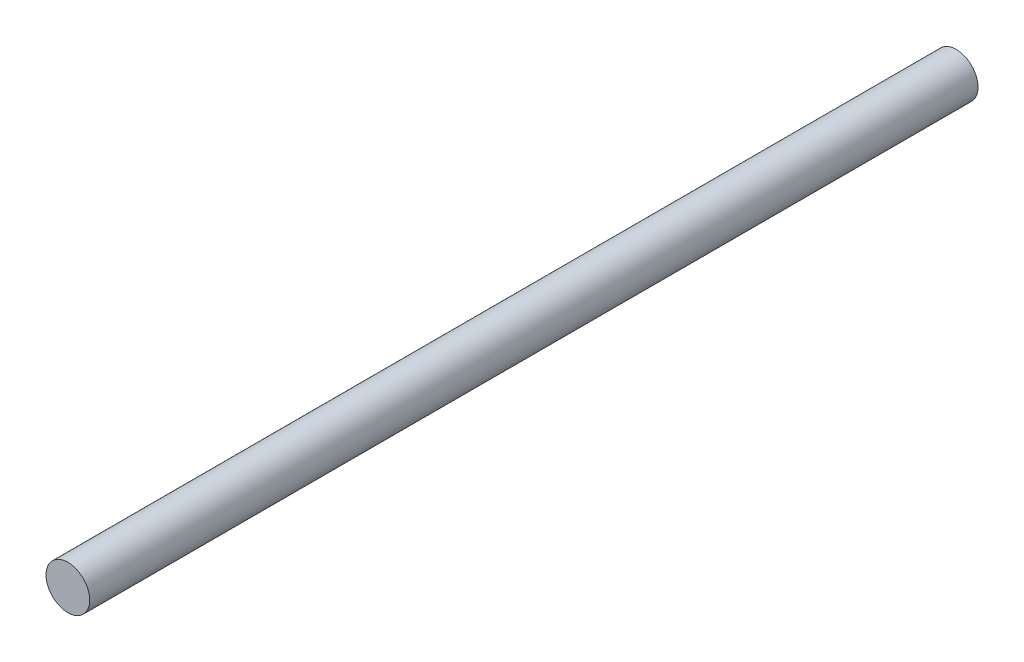
ISO-10303-21;
HEADER;
FILE_DESCRIPTION(('STEP AP214'),'2;1');
FILE_NAME('part.step','',(''),(''),'','','');
FILE_SCHEMA(('AUTOMOTIVE_DESIGN { 1 0 10303 214 1 1 1 1 }'));
ENDSEC;
DATA;
#1=APPLICATION_CONTEXT('core data for automotive mechanical design processes');
#2=APPLICATION_PROTOCOL_DEFINITION('international standard','automotive_design',2000,#1);
#3=PRODUCT_CONTEXT('',#1,'mechanical');
#4=PRODUCT('Part','Part','',(#3));
#5=PRODUCT_RELATED_PRODUCT_CATEGORY('part','',(#4));
#6=PRODUCT_DEFINITION_FORMATION('','',#4);
#7=PRODUCT_DEFINITION_CONTEXT('part definition',#1,'design');
#8=PRODUCT_DEFINITION('design','',#6,#7);
#9=PRODUCT_DEFINITION_SHAPE('','',#8);
#10=(LENGTH_UNIT() NAMED_UNIT(*) SI_UNIT(.MILLI.,.METRE.));
#11=(NAMED_UNIT(*) PLANE_ANGLE_UNIT() SI_UNIT($,.RADIAN.));
#12=(NAMED_UNIT(*) SI_UNIT($,.STERADIAN.) SOLID_ANGLE_UNIT());
#13=UNCERTAINTY_MEASURE_WITH_UNIT(LENGTH_MEASURE(1.E-05),#10,'distance_accuracy_value','');
#14=(GEOMETRIC_REPRESENTATION_CONTEXT(3) GLOBAL_UNCERTAINTY_ASSIGNED_CONTEXT((#13)) GLOBAL_UNIT_ASSIGNED_CONTEXT((#10,
#11,#12)) REPRESENTATION_CONTEXT('',''));
#15=CARTESIAN_POINT('',(0.,0.,0.));
#16=DIRECTION('',(0.,0.,1.));
#17=DIRECTION('',(1.,0.,0.));
#18=AXIS2_PLACEMENT_3D('',#15,#16,#17);
#19=CARTESIAN_POINT('',(0.,0.,61.));
#20=DIRECTION('',(0.,0.,-1.));
#21=DIRECTION('',(-1.,0.,0.));
#22=AXIS2_PLACEMENT_3D('',#19,#20,#21);
#23=CYLINDRICAL_SURFACE('',#22,1.5);
#24=CARTESIAN_POINT('',(0.,0.,61.));
#25=DIRECTION('',(0.,0.,1.));
#26=DIRECTION('',(1.,0.,0.));
#27=AXIS2_PLACEMENT_3D('',#24,#25,#26);
#28=CIRCLE('',#27,1.5);
#29=CARTESIAN_POINT('',(-1.5,0.,61.));
#30=VERTEX_POINT('',#29);
#31=EDGE_CURVE('E10',#30,#30,#28,.T.);
#32=CARTESIAN_POINT('',(0.,0.,0.));
#33=DIRECTION('',(0.,0.,1.));
#34=DIRECTION('',(1.,0.,0.));
#35=AXIS2_PLACEMENT_3D('',#32,#33,#34);
#36=CIRCLE('',#35,1.5);
#37=CARTESIAN_POINT('',(-1.5,0.,0.));
#38=VERTEX_POINT('',#37);
#39=EDGE_CURVE('E33',#38,#38,#36,.T.);
#40=CARTESIAN_POINT('',(-1.5,0.,61.));
#41=CARTESIAN_POINT('',(-1.5,0.,60.3645833333333));
#42=CARTESIAN_POINT('',(-1.5,0.,59.7291666666667));
#43=CARTESIAN_POINT('',(-1.5,0.,58.4583333333333));
#44=CARTESIAN_POINT('',(-1.5,0.,57.8229166666667));
#45=CARTESIAN_POINT('',(-1.5,0.,56.5520833333333));
#46=CARTESIAN_POINT('',(-1.5,0.,55.9166666666667));
#47=CARTESIAN_POINT('',(-1.5,0.,54.6458333333333));
#48=CARTESIAN_POINT('',(-1.5,0.,54.0104166666667));
#49=CARTESIAN_POINT('',(-1.5,0.,52.7395833333333));
#50=CARTESIAN_POINT('',(-1.5,0.,52.1041666666667));
#51=CARTESIAN_POINT('',(-1.5,0.,50.8333333333333));
#52=CARTESIAN_POINT('',(-1.5,0.,50.1979166666667));
#53=CARTESIAN_POINT('',(-1.5,0.,48.9270833333333));
#54=CARTESIAN_POINT('',(-1.5,0.,48.2916666666667));
#55=CARTESIAN_POINT('',(-1.5,0.,47.0208333333333));
#56=CARTESIAN_POINT('',(-1.5,0.,46.3854166666667));
#57=CARTESIAN_POINT('',(-1.5,0.,45.1145833333333));
#58=CARTESIAN_POINT('',(-1.5,0.,44.4791666666667));
#59=CARTESIAN_POINT('',(-1.5,0.,43.2083333333333));
#60=CARTESIAN_POINT('',(-1.5,0.,42.5729166666667));
#61=CARTESIAN_POINT('',(-1.5,0.,41.3020833333333));
#62=CARTESIAN_POINT('',(-1.5,0.,40.6666666666667));
#63=CARTESIAN_POINT('',(-1.5,0.,39.3958333333333));
#64=CARTESIAN_POINT('',(-1.5,0.,38.7604166666667));
#65=CARTESIAN_POINT('',(-1.5,0.,37.4895833333333));
#66=CARTESIAN_POINT('',(-1.5,0.,36.8541666666667));
#67=CARTESIAN_POINT('',(-1.5,0.,35.5833333333333));
#68=CARTESIAN_POINT('',(-1.5,0.,34.9479166666667));
#69=CARTESIAN_POINT('',(-1.5,0.,33.6770833333333));
#70=CARTESIAN_POINT('',(-1.5,0.,33.0416666666667));
#71=CARTESIAN_POINT('',(-1.5,0.,31.7708333333333));
#72=CARTESIAN_POINT('',(-1.5,0.,31.1354166666667));
#73=CARTESIAN_POINT('',(-1.5,0.,29.8645833333333));
#74=CARTESIAN_POINT('',(-1.5,0.,29.2291666666667));
#75=CARTESIAN_POINT('',(-1.5,0.,27.9583333333333));
#76=CARTESIAN_POINT('',(-1.5,0.,27.3229166666667));
#77=CARTESIAN_POINT('',(-1.5,0.,26.0520833333333));
#78=CARTESIAN_POINT('',(-1.5,0.,25.4166666666667));
#79=CARTESIAN_POINT('',(-1.5,0.,24.1458333333333));
#80=CARTESIAN_POINT('',(-1.5,0.,23.5104166666667));
#81=CARTESIAN_POINT('',(-1.5,0.,22.2395833333333));
#82=CARTESIAN_POINT('',(-1.5,0.,21.6041666666667));
#83=CARTESIAN_POINT('',(-1.5,0.,20.3333333333333));
#84=CARTESIAN_POINT('',(-1.5,0.,19.6979166666667));
#85=CARTESIAN_POINT('',(-1.5,0.,18.4270833333333));
#86=CARTESIAN_POINT('',(-1.5,0.,17.7916666666667));
#87=CARTESIAN_POINT('',(-1.5,0.,16.5208333333333));
#88=CARTESIAN_POINT('',(-1.5,0.,15.8854166666667));
#89=CARTESIAN_POINT('',(-1.5,0.,14.6145833333333));
#90=CARTESIAN_POINT('',(-1.5,0.,13.9791666666667));
#91=CARTESIAN_POINT('',(-1.5,0.,12.7083333333333));
#92=CARTESIAN_POINT('',(-1.5,0.,12.0729166666667));
#93=CARTESIAN_POINT('',(-1.5,0.,10.8020833333333));
#94=CARTESIAN_POINT('',(-1.5,0.,10.1666666666667));
#95=CARTESIAN_POINT('',(-1.5,0.,8.89583333333333));
#96=CARTESIAN_POINT('',(-1.5,0.,8.26041666666666));
#97=CARTESIAN_POINT('',(-1.5,0.,6.98958333333333));
#98=CARTESIAN_POINT('',(-1.5,0.,6.35416666666666));
#99=CARTESIAN_POINT('',(-1.5,0.,5.08333333333333));
#100=CARTESIAN_POINT('',(-1.5,0.,4.44791666666666));
#101=CARTESIAN_POINT('',(-1.5,0.,3.17708333333333));
#102=CARTESIAN_POINT('',(-1.5,0.,2.54166666666666));
#103=CARTESIAN_POINT('',(-1.5,0.,1.27083333333332));
#104=CARTESIAN_POINT('',(-1.5,0.,0.635416666666658));
#105=CARTESIAN_POINT('',(-1.5,0.,0.));
#106=B_SPLINE_CURVE_WITH_KNOTS('',3,(#40,#41,#42,#43,#44,#45,#46,#47,#48,#49,#50,#51,#52,#53,
#54,#55,#56,#57,#58,#59,#60,#61,#62,#63,#64,#65,#66,#67,#68,#69,#70,#71,#72,#73,#74,#75,#76,#77,
#78,#79,#80,#81,#82,#83,#84,#85,#86,#87,#88,#89,#90,#91,#92,#93,#94,#95,#96,#97,#98,#99,#100,
#101,#102,#103,#104,#105),.UNSPECIFIED.,.F.,.F.,(4,2,2,2,2,2,2,2,2,2,2,2,2,2,2,2,2,2,2,2,2,2,2,
2,2,2,2,2,2,2,2,2,4),(0.,1.90625000000001,3.8125,5.71875,7.62500000000001,9.53125000000001,
11.4375,13.34375,15.25,17.15625,19.0625,20.96875,22.875,24.78125,26.6875,28.59375,30.5,32.40625,
34.3125,36.21875,38.125,40.03125,41.9375,43.84375,45.75,47.65625,49.5625,51.46875,53.375,
55.28125,57.1875,59.09375,61.),.UNSPECIFIED.);
#107=EDGE_CURVE('BSEAM30',#30,#38,#106,.T.);
#108=ORIENTED_EDGE('',*,*,#31,.F.);
#109=ORIENTED_EDGE('',*,*,#39,.T.);
#110=ORIENTED_EDGE('',*,*,#107,.T.);
#111=ORIENTED_EDGE('',*,*,#107,.F.);
#112=EDGE_LOOP('',(#108,#110,#109,#111));
#113=FACE_BOUND('',#112,.T.);
#114=ADVANCED_FACE('F30',(#113),#23,.T.);
#115=CARTESIAN_POINT('',(0.,0.,61.));
#116=DIRECTION('',(0.,0.,1.));
#117=DIRECTION('',(1.,0.,0.));
#118=AXIS2_PLACEMENT_3D('',#115,#116,#117);
#119=PLANE('',#118);
#120=ORIENTED_EDGE('',*,*,#31,.T.);
#121=EDGE_LOOP('',(#120));
#122=FACE_BOUND('',#121,.T.);
#123=ADVANCED_FACE('F45',(#122),#119,.T.);
#124=CARTESIAN_POINT('',(0.,0.,0.));
#125=DIRECTION('',(0.,0.,1.));
#126=DIRECTION('',(1.,0.,0.));
#127=AXIS2_PLACEMENT_3D('',#124,#125,#126);
#128=PLANE('',#127);
#129=ORIENTED_EDGE('',*,*,#39,.F.);
#130=EDGE_LOOP('',(#129));
#131=FACE_BOUND('',#130,.T.);
#132=ADVANCED_FACE('F43',(#131),#128,.F.);
#133=CLOSED_SHELL('',(#114,#123,#132));
#134=MANIFOLD_SOLID_BREP('B2',#133);
#135=ADVANCED_BREP_SHAPE_REPRESENTATION('',(#18,#134),#14);
#136=SHAPE_DEFINITION_REPRESENTATION(#9,#135);
ENDSEC;
END-ISO-10303-21;
